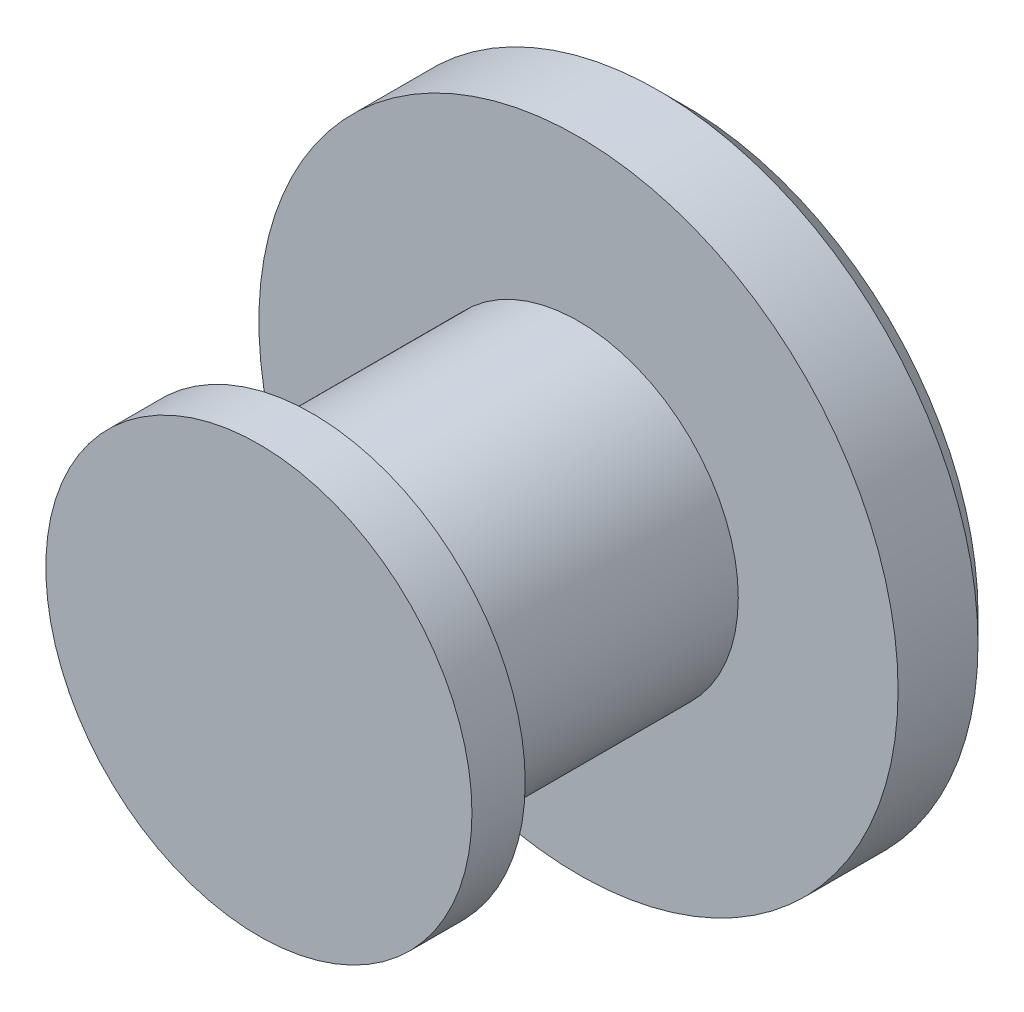
ISO-10303-21;
HEADER;
FILE_DESCRIPTION(('STEP AP214'),'2;1');
FILE_NAME('part.step','',(''),(''),'','','');
FILE_SCHEMA(('AUTOMOTIVE_DESIGN { 1 0 10303 214 1 1 1 1 }'));
ENDSEC;
DATA;
#1=APPLICATION_CONTEXT('core data for automotive mechanical design processes');
#2=APPLICATION_PROTOCOL_DEFINITION('international standard','automotive_design',2000,#1);
#3=PRODUCT_CONTEXT('',#1,'mechanical');
#4=PRODUCT('Part','Part','',(#3));
#5=PRODUCT_RELATED_PRODUCT_CATEGORY('part','',(#4));
#6=PRODUCT_DEFINITION_FORMATION('','',#4);
#7=PRODUCT_DEFINITION_CONTEXT('part definition',#1,'design');
#8=PRODUCT_DEFINITION('design','',#6,#7);
#9=PRODUCT_DEFINITION_SHAPE('','',#8);
#10=(LENGTH_UNIT() NAMED_UNIT(*) SI_UNIT(.MILLI.,.METRE.));
#11=(NAMED_UNIT(*) PLANE_ANGLE_UNIT() SI_UNIT($,.RADIAN.));
#12=(NAMED_UNIT(*) SI_UNIT($,.STERADIAN.) SOLID_ANGLE_UNIT());
#13=UNCERTAINTY_MEASURE_WITH_UNIT(LENGTH_MEASURE(1.E-05),#10,'distance_accuracy_value','');
#14=(GEOMETRIC_REPRESENTATION_CONTEXT(3) GLOBAL_UNCERTAINTY_ASSIGNED_CONTEXT((#13)) GLOBAL_UNIT_ASSIGNED_CONTEXT((#10,
#11,#12)) REPRESENTATION_CONTEXT('',''));
#15=CARTESIAN_POINT('',(0.,0.,0.));
#16=DIRECTION('',(0.,0.,1.));
#17=DIRECTION('',(1.,0.,0.));
#18=AXIS2_PLACEMENT_3D('',#15,#16,#17);
#19=CARTESIAN_POINT('',(0.,0.,5.));
#20=DIRECTION('',(0.,0.,-1.));
#21=DIRECTION('',(-1.,0.,0.));
#22=AXIS2_PLACEMENT_3D('',#19,#20,#21);
#23=CYLINDRICAL_SURFACE('',#22,3.);
#24=CARTESIAN_POINT('',(0.,0.,5.));
#25=DIRECTION('',(0.,0.,1.));
#26=DIRECTION('',(1.,0.,0.));
#27=AXIS2_PLACEMENT_3D('',#24,#25,#26);
#28=CIRCLE('',#27,3.);
#29=CARTESIAN_POINT('',(3.,0.,5.));
#30=VERTEX_POINT('',#29);
#31=EDGE_CURVE('E62',#30,#30,#28,.T.);
#32=ORIENTED_EDGE('',*,*,#31,.F.);
#33=EDGE_LOOP('',(#32));
#34=FACE_BOUND('',#33,.T.);
#35=CARTESIAN_POINT('',(0.,0.,0.));
#36=DIRECTION('',(0.,0.,1.));
#37=DIRECTION('',(1.,0.,0.));
#38=AXIS2_PLACEMENT_3D('',#35,#36,#37);
#39=CIRCLE('',#38,3.);
#40=CARTESIAN_POINT('',(3.,0.,0.));
#41=VERTEX_POINT('',#40);
#42=EDGE_CURVE('E71',#41,#41,#39,.T.);
#43=ORIENTED_EDGE('',*,*,#42,.T.);
#44=EDGE_LOOP('',(#43));
#45=FACE_BOUND('',#44,.T.);
#46=ADVANCED_FACE('F47',(#34,#45),#23,.T.);
#47=CARTESIAN_POINT('',(0.,0.,6.));
#48=DIRECTION('',(0.,0.,-1.));
#49=DIRECTION('',(-1.,0.,0.));
#50=AXIS2_PLACEMENT_3D('',#47,#48,#49);
#51=CYLINDRICAL_SURFACE('',#50,4.);
#52=CARTESIAN_POINT('',(0.,0.,6.));
#53=DIRECTION('',(0.,0.,1.));
#54=DIRECTION('',(1.,0.,0.));
#55=AXIS2_PLACEMENT_3D('',#52,#53,#54);
#56=CIRCLE('',#55,4.);
#57=CARTESIAN_POINT('',(4.,0.,6.));
#58=VERTEX_POINT('',#57);
#59=EDGE_CURVE('E68',#58,#58,#56,.T.);
#60=ORIENTED_EDGE('',*,*,#59,.F.);
#61=EDGE_LOOP('',(#60));
#62=FACE_BOUND('',#61,.T.);
#63=CARTESIAN_POINT('',(0.,0.,5.));
#64=DIRECTION('',(0.,0.,1.));
#65=DIRECTION('',(1.,0.,0.));
#66=AXIS2_PLACEMENT_3D('',#63,#64,#65);
#67=CIRCLE('',#66,4.);
#68=CARTESIAN_POINT('',(4.,0.,5.));
#69=VERTEX_POINT('',#68);
#70=EDGE_CURVE('E74',#69,#69,#67,.T.);
#71=ORIENTED_EDGE('',*,*,#70,.T.);
#72=EDGE_LOOP('',(#71));
#73=FACE_BOUND('',#72,.T.);
#74=ADVANCED_FACE('F107',(#62,#73),#51,.T.);
#75=CARTESIAN_POINT('',(0.,0.,6.));
#76=DIRECTION('',(0.,0.,1.));
#77=DIRECTION('',(1.,0.,0.));
#78=AXIS2_PLACEMENT_3D('',#75,#76,#77);
#79=PLANE('',#78);
#80=ORIENTED_EDGE('',*,*,#59,.T.);
#81=EDGE_LOOP('',(#80));
#82=FACE_BOUND('',#81,.T.);
#83=ADVANCED_FACE('F101',(#82),#79,.T.);
#84=CARTESIAN_POINT('',(0.,0.,5.));
#85=DIRECTION('',(0.,0.,1.));
#86=DIRECTION('',(1.,0.,0.));
#87=AXIS2_PLACEMENT_3D('',#84,#85,#86);
#88=PLANE('',#87);
#89=ORIENTED_EDGE('',*,*,#31,.T.);
#90=EDGE_LOOP('',(#89));
#91=FACE_BOUND('',#90,.T.);
#92=ORIENTED_EDGE('',*,*,#70,.F.);
#93=EDGE_LOOP('',(#92));
#94=FACE_BOUND('',#93,.T.);
#95=ADVANCED_FACE('F93',(#91,#94),#88,.F.);
#96=CARTESIAN_POINT('',(0.,0.,-2.));
#97=DIRECTION('',(0.,0.,1.));
#98=DIRECTION('',(1.,0.,0.));
#99=AXIS2_PLACEMENT_3D('',#96,#97,#98);
#100=CYLINDRICAL_SURFACE('',#99,6.);
#101=CARTESIAN_POINT('',(0.,0.,-1.5));
#102=DIRECTION('',(0.,0.,1.));
#103=DIRECTION('',(1.,0.,0.));
#104=AXIS2_PLACEMENT_3D('',#101,#102,#103);
#105=CIRCLE('',#104,6.);
#106=CARTESIAN_POINT('',(6.,0.,-1.5));
#107=VERTEX_POINT('',#106);
#108=EDGE_CURVE('E56',#107,#107,#105,.T.);
#109=ORIENTED_EDGE('',*,*,#108,.T.);
#110=EDGE_LOOP('',(#109));
#111=FACE_BOUND('',#110,.T.);
#112=CARTESIAN_POINT('',(0.,0.,0.));
#113=DIRECTION('',(0.,0.,1.));
#114=DIRECTION('',(1.,0.,0.));
#115=AXIS2_PLACEMENT_3D('',#112,#113,#114);
#116=CIRCLE('',#115,6.);
#117=CARTESIAN_POINT('',(6.,0.,0.));
#118=VERTEX_POINT('',#117);
#119=EDGE_CURVE('E75',#118,#118,#116,.T.);
#120=ORIENTED_EDGE('',*,*,#119,.F.);
#121=EDGE_LOOP('',(#120));
#122=FACE_BOUND('',#121,.T.);
#123=ADVANCED_FACE('F90',(#111,#122),#100,.T.);
#124=CARTESIAN_POINT('',(0.,0.,-2.));
#125=DIRECTION('',(0.,0.,1.));
#126=DIRECTION('',(1.,0.,0.));
#127=AXIS2_PLACEMENT_3D('',#124,#125,#126);
#128=PLANE('',#127);
#129=CARTESIAN_POINT('',(0.,0.,-2.));
#130=DIRECTION('',(0.,0.,1.));
#131=DIRECTION('',(1.,0.,0.));
#132=AXIS2_PLACEMENT_3D('',#129,#130,#131);
#133=CIRCLE('',#132,5.5);
#134=CARTESIAN_POINT('',(5.5,0.,-2.));
#135=VERTEX_POINT('',#134);
#136=EDGE_CURVE('E10',#135,#135,#133,.F.);
#137=ORIENTED_EDGE('',*,*,#136,.T.);
#138=EDGE_LOOP('',(#137));
#139=FACE_BOUND('',#138,.T.);
#140=ADVANCED_FACE('F92',(#139),#128,.F.);
#141=CARTESIAN_POINT('',(0.,0.,0.));
#142=DIRECTION('',(0.,0.,1.));
#143=DIRECTION('',(1.,0.,0.));
#144=AXIS2_PLACEMENT_3D('',#141,#142,#143);
#145=PLANE('',#144);
#146=ORIENTED_EDGE('',*,*,#42,.F.);
#147=EDGE_LOOP('',(#146));
#148=FACE_BOUND('',#147,.T.);
#149=ORIENTED_EDGE('',*,*,#119,.T.);
#150=EDGE_LOOP('',(#149));
#151=FACE_BOUND('',#150,.T.);
#152=ADVANCED_FACE('F88',(#148,#151),#145,.T.);
#153=CARTESIAN_POINT('',(0.,0.,-1.5));
#154=DIRECTION('',(0.,0.,1.));
#155=DIRECTION('',(1.,0.,0.));
#156=AXIS2_PLACEMENT_3D('',#153,#154,#155);
#157=CONICAL_SURFACE('',#156,6.,0.785398163397448);
#158=ORIENTED_EDGE('',*,*,#136,.F.);
#159=EDGE_LOOP('',(#158));
#160=FACE_BOUND('',#159,.T.);
#161=ORIENTED_EDGE('',*,*,#108,.F.);
#162=EDGE_LOOP('',(#161));
#163=FACE_BOUND('',#162,.T.);
#164=ADVANCED_FACE('F50',(#160,#163),#157,.T.);
#165=CLOSED_SHELL('',(#46,#74,#83,#95,#123,#140,#152,#164));
#166=MANIFOLD_SOLID_BREP('B2',#165);
#167=ADVANCED_BREP_SHAPE_REPRESENTATION('',(#18,#166),#14);
#168=SHAPE_DEFINITION_REPRESENTATION(#9,#167);
ENDSEC;
END-ISO-10303-21;
